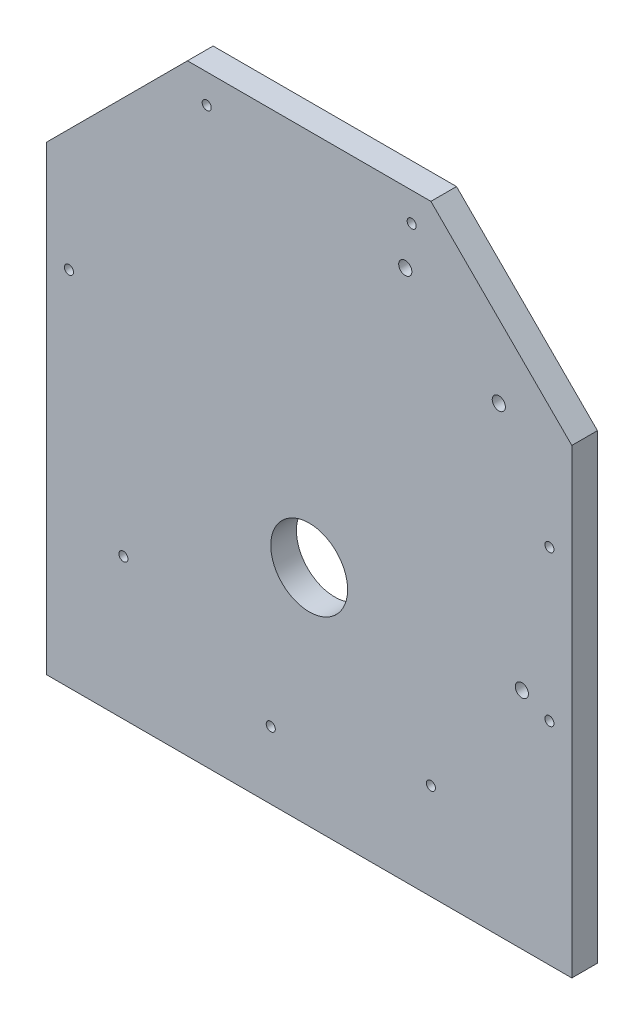
ISO-10303-21;
HEADER;
FILE_DESCRIPTION(('STEP AP214'),'2;1');
FILE_NAME('part.step','',(''),(''),'','','');
FILE_SCHEMA(('AUTOMOTIVE_DESIGN { 1 0 10303 214 1 1 1 1 }'));
ENDSEC;
DATA;
#1=APPLICATION_CONTEXT('core data for automotive mechanical design processes');
#2=APPLICATION_PROTOCOL_DEFINITION('international standard','automotive_design',2000,#1);
#3=PRODUCT_CONTEXT('',#1,'mechanical');
#4=PRODUCT('Part','Part','',(#3));
#5=PRODUCT_RELATED_PRODUCT_CATEGORY('part','',(#4));
#6=PRODUCT_DEFINITION_FORMATION('','',#4);
#7=PRODUCT_DEFINITION_CONTEXT('part definition',#1,'design');
#8=PRODUCT_DEFINITION('design','',#6,#7);
#9=PRODUCT_DEFINITION_SHAPE('','',#8);
#10=(LENGTH_UNIT() NAMED_UNIT(*) SI_UNIT(.MILLI.,.METRE.));
#11=(NAMED_UNIT(*) PLANE_ANGLE_UNIT() SI_UNIT($,.RADIAN.));
#12=(NAMED_UNIT(*) SI_UNIT($,.STERADIAN.) SOLID_ANGLE_UNIT());
#13=UNCERTAINTY_MEASURE_WITH_UNIT(LENGTH_MEASURE(1.E-05),#10,'distance_accuracy_value','');
#14=(GEOMETRIC_REPRESENTATION_CONTEXT(3) GLOBAL_UNCERTAINTY_ASSIGNED_CONTEXT((#13)) GLOBAL_UNIT_ASSIGNED_CONTEXT((#10,
#11,#12)) REPRESENTATION_CONTEXT('',''));
#15=CARTESIAN_POINT('',(0.,0.,0.));
#16=DIRECTION('',(0.,0.,1.));
#17=DIRECTION('',(1.,0.,0.));
#18=AXIS2_PLACEMENT_3D('',#15,#16,#17);
#19=CARTESIAN_POINT('',(0.,0.,12.7));
#20=DIRECTION('',(0.,0.,1.));
#21=DIRECTION('',(1.,0.,0.));
#22=AXIS2_PLACEMENT_3D('',#19,#20,#21);
#23=PLANE('',#22);
#24=CARTESIAN_POINT('',(105.41,-57.15,12.7));
#25=DIRECTION('',(0.,0.,-1.));
#26=DIRECTION('',(-1.,0.,0.));
#27=AXIS2_PLACEMENT_3D('',#24,#25,#26);
#28=CIRCLE('',#27,3.2639);
#29=CARTESIAN_POINT('',(102.1461,-57.15,12.7));
#30=VERTEX_POINT('',#29);
#31=EDGE_CURVE('E233',#30,#30,#28,.T.);
#32=ORIENTED_EDGE('',*,*,#31,.T.);
#33=EDGE_LOOP('',(#32));
#34=FACE_BOUND('',#33,.T.);
#35=CARTESIAN_POINT('',(93.98,60.325,12.7));
#36=DIRECTION('',(0.,0.,-1.));
#37=DIRECTION('',(-1.,0.,0.));
#38=AXIS2_PLACEMENT_3D('',#35,#36,#37);
#39=CIRCLE('',#38,3.2639);
#40=CARTESIAN_POINT('',(90.7161,60.325,12.7));
#41=VERTEX_POINT('',#40);
#42=EDGE_CURVE('E246',#41,#41,#39,.T.);
#43=ORIENTED_EDGE('',*,*,#42,.T.);
#44=EDGE_LOOP('',(#43));
#45=FACE_BOUND('',#44,.T.);
#46=CARTESIAN_POINT('',(47.625,95.25,12.7));
#47=DIRECTION('',(0.,0.,-1.));
#48=DIRECTION('',(-1.,0.,0.));
#49=AXIS2_PLACEMENT_3D('',#46,#47,#48);
#50=CIRCLE('',#49,3.2639);
#51=CARTESIAN_POINT('',(44.3611,95.25,12.7));
#52=VERTEX_POINT('',#51);
#53=EDGE_CURVE('E254',#52,#52,#50,.T.);
#54=ORIENTED_EDGE('',*,*,#53,.T.);
#55=EDGE_LOOP('',(#54));
#56=FACE_BOUND('',#55,.T.);
#57=CARTESIAN_POINT('',(-50.8,115.9002,12.7));
#58=DIRECTION('',(0.,0.,1.));
#59=DIRECTION('',(1.,0.,0.));
#60=AXIS2_PLACEMENT_3D('',#57,#58,#59);
#61=CIRCLE('',#60,2.2479);
#62=CARTESIAN_POINT('',(-48.5521,115.9002,12.7));
#63=VERTEX_POINT('',#62);
#64=EDGE_CURVE('E258',#63,#63,#61,.T.);
#65=ORIENTED_EDGE('',*,*,#64,.F.);
#66=EDGE_LOOP('',(#65));
#67=FACE_BOUND('',#66,.T.);
#68=CARTESIAN_POINT('',(50.8,115.9002,12.7));
#69=DIRECTION('',(0.,0.,1.));
#70=DIRECTION('',(1.,0.,0.));
#71=AXIS2_PLACEMENT_3D('',#68,#69,#70);
#72=CIRCLE('',#71,2.2479);
#73=CARTESIAN_POINT('',(53.0479,115.9002,12.7));
#74=VERTEX_POINT('',#73);
#75=EDGE_CURVE('E266',#74,#74,#72,.T.);
#76=ORIENTED_EDGE('',*,*,#75,.F.);
#77=EDGE_LOOP('',(#76));
#78=FACE_BOUND('',#77,.T.);
#79=CARTESIAN_POINT('',(119.0752,11.1252,12.7));
#80=DIRECTION('',(0.,0.,1.));
#81=DIRECTION('',(1.,0.,0.));
#82=AXIS2_PLACEMENT_3D('',#79,#80,#81);
#83=CIRCLE('',#82,2.2479);
#84=CARTESIAN_POINT('',(121.3231,11.1252,12.7));
#85=VERTEX_POINT('',#84);
#86=EDGE_CURVE('E274',#85,#85,#83,.T.);
#87=ORIENTED_EDGE('',*,*,#86,.F.);
#88=EDGE_LOOP('',(#87));
#89=FACE_BOUND('',#88,.T.);
#90=CARTESIAN_POINT('',(119.0752,-63.5,12.7));
#91=DIRECTION('',(0.,0.,1.));
#92=DIRECTION('',(1.,0.,0.));
#93=AXIS2_PLACEMENT_3D('',#90,#91,#92);
#94=CIRCLE('',#93,2.2479);
#95=CARTESIAN_POINT('',(121.3231,-63.5,12.7));
#96=VERTEX_POINT('',#95);
#97=EDGE_CURVE('E282',#96,#96,#94,.T.);
#98=ORIENTED_EDGE('',*,*,#97,.F.);
#99=EDGE_LOOP('',(#98));
#100=FACE_BOUND('',#99,.T.);
#101=CARTESIAN_POINT('',(60.325,-120.65,12.7));
#102=DIRECTION('',(0.,0.,1.));
#103=DIRECTION('',(1.,0.,0.));
#104=AXIS2_PLACEMENT_3D('',#101,#102,#103);
#105=CIRCLE('',#104,2.2479);
#106=CARTESIAN_POINT('',(62.5729,-120.65,12.7));
#107=VERTEX_POINT('',#106);
#108=EDGE_CURVE('E290',#107,#107,#105,.T.);
#109=ORIENTED_EDGE('',*,*,#108,.F.);
#110=EDGE_LOOP('',(#109));
#111=FACE_BOUND('',#110,.T.);
#112=CARTESIAN_POINT('',(-19.05,-134.9375,12.7));
#113=DIRECTION('',(0.,0.,1.));
#114=DIRECTION('',(1.,0.,0.));
#115=AXIS2_PLACEMENT_3D('',#112,#113,#114);
#116=CIRCLE('',#115,2.2479);
#117=CARTESIAN_POINT('',(-16.8021,-134.9375,12.7));
#118=VERTEX_POINT('',#117);
#119=EDGE_CURVE('E298',#118,#118,#116,.T.);
#120=ORIENTED_EDGE('',*,*,#119,.F.);
#121=EDGE_LOOP('',(#120));
#122=FACE_BOUND('',#121,.T.);
#123=CARTESIAN_POINT('',(-92.075,-98.425,12.7));
#124=DIRECTION('',(0.,0.,1.));
#125=DIRECTION('',(1.,0.,0.));
#126=AXIS2_PLACEMENT_3D('',#123,#124,#125);
#127=CIRCLE('',#126,2.2479);
#128=CARTESIAN_POINT('',(-89.8271,-98.425,12.7));
#129=VERTEX_POINT('',#128);
#130=EDGE_CURVE('E306',#129,#129,#127,.T.);
#131=ORIENTED_EDGE('',*,*,#130,.F.);
#132=EDGE_LOOP('',(#131));
#133=FACE_BOUND('',#132,.T.);
#134=CARTESIAN_POINT('',(-119.0752,11.1252,12.7));
#135=DIRECTION('',(0.,0.,1.));
#136=DIRECTION('',(1.,0.,0.));
#137=AXIS2_PLACEMENT_3D('',#134,#135,#136);
#138=CIRCLE('',#137,2.2479);
#139=CARTESIAN_POINT('',(-116.8273,11.1252,12.7));
#140=VERTEX_POINT('',#139);
#141=EDGE_CURVE('E314',#140,#140,#138,.T.);
#142=ORIENTED_EDGE('',*,*,#141,.F.);
#143=EDGE_LOOP('',(#142));
#144=FACE_BOUND('',#143,.T.);
#145=DIRECTION('',(0.,1.,0.));
#146=VECTOR('',#145,1.);
#147=CARTESIAN_POINT('',(130.175,-168.275,12.7));
#148=LINE('',#147,#146);
#149=CARTESIAN_POINT('',(130.175,-168.275,12.7));
#150=VERTEX_POINT('',#149);
#151=CARTESIAN_POINT('',(130.175,60.3249999999998,12.7));
#152=VERTEX_POINT('',#151);
#153=EDGE_CURVE('E145',#150,#152,#148,.T.);
#154=ORIENTED_EDGE('',*,*,#153,.T.);
#155=DIRECTION('',(-0.707106781186546,0.707106781186549,0.));
#156=VECTOR('',#155,1.);
#157=CARTESIAN_POINT('',(130.175,60.3249999999998,12.7));
#158=LINE('',#157,#156);
#159=CARTESIAN_POINT('',(60.325,130.175,12.7));
#160=VERTEX_POINT('',#159);
#161=EDGE_CURVE('E93',#152,#160,#158,.T.);
#162=ORIENTED_EDGE('',*,*,#161,.T.);
#163=DIRECTION('',(-1.,0.,0.));
#164=VECTOR('',#163,1.);
#165=CARTESIAN_POINT('',(60.325,130.175,12.7));
#166=LINE('',#165,#164);
#167=CARTESIAN_POINT('',(-60.325,130.175,12.7));
#168=VERTEX_POINT('',#167);
#169=EDGE_CURVE('E106',#160,#168,#166,.T.);
#170=ORIENTED_EDGE('',*,*,#169,.T.);
#171=DIRECTION('',(-0.707106781186549,-0.707106781186547,0.));
#172=VECTOR('',#171,1.);
#173=CARTESIAN_POINT('',(-60.325,130.175,12.7));
#174=LINE('',#173,#172);
#175=CARTESIAN_POINT('',(-130.175,60.3250000000002,12.7));
#176=VERTEX_POINT('',#175);
#177=EDGE_CURVE('E100',#168,#176,#174,.T.);
#178=ORIENTED_EDGE('',*,*,#177,.T.);
#179=DIRECTION('',(0.,-1.,0.));
#180=VECTOR('',#179,1.);
#181=CARTESIAN_POINT('',(-130.175,60.3250000000002,12.7));
#182=LINE('',#181,#180);
#183=CARTESIAN_POINT('',(-130.175,-168.275,12.7));
#184=VERTEX_POINT('',#183);
#185=EDGE_CURVE('E104',#176,#184,#182,.T.);
#186=ORIENTED_EDGE('',*,*,#185,.T.);
#187=DIRECTION('',(1.,0.,0.));
#188=VECTOR('',#187,1.);
#189=CARTESIAN_POINT('',(-130.175,-168.275,12.7));
#190=LINE('',#189,#188);
#191=EDGE_CURVE('E56',#184,#150,#190,.T.);
#192=ORIENTED_EDGE('',*,*,#191,.T.);
#193=EDGE_LOOP('',(#154,#162,#170,#178,#186,#192));
#194=FACE_BOUND('',#193,.T.);
#195=CARTESIAN_POINT('',(0.,-57.15,12.7));
#196=DIRECTION('',(0.,0.,1.));
#197=DIRECTION('',(1.,0.,0.));
#198=AXIS2_PLACEMENT_3D('',#195,#196,#197);
#199=CIRCLE('',#198,19.05);
#200=CARTESIAN_POINT('',(19.05,-57.15,12.7));
#201=VERTEX_POINT('',#200);
#202=EDGE_CURVE('E133',#201,#201,#199,.T.);
#203=ORIENTED_EDGE('',*,*,#202,.F.);
#204=EDGE_LOOP('',(#203));
#205=FACE_BOUND('',#204,.T.);
#206=ADVANCED_FACE('F38',(#34,#45,#56,#67,#78,#89,#100,#111,#122,#133,#144,#194,#205),#23,.T.);
#207=CARTESIAN_POINT('',(0.,0.,0.));
#208=DIRECTION('',(0.,0.,1.));
#209=DIRECTION('',(1.,0.,0.));
#210=AXIS2_PLACEMENT_3D('',#207,#208,#209);
#211=PLANE('',#210);
#212=CARTESIAN_POINT('',(105.41,-57.15,0.));
#213=DIRECTION('',(0.,0.,-1.));
#214=DIRECTION('',(-1.,0.,0.));
#215=AXIS2_PLACEMENT_3D('',#212,#213,#214);
#216=CIRCLE('',#215,3.2639);
#217=CARTESIAN_POINT('',(102.1461,-57.15,0.));
#218=VERTEX_POINT('',#217);
#219=EDGE_CURVE('E236',#218,#218,#216,.T.);
#220=ORIENTED_EDGE('',*,*,#219,.F.);
#221=EDGE_LOOP('',(#220));
#222=FACE_BOUND('',#221,.T.);
#223=CARTESIAN_POINT('',(93.98,60.325,0.));
#224=DIRECTION('',(0.,0.,-1.));
#225=DIRECTION('',(-1.,0.,0.));
#226=AXIS2_PLACEMENT_3D('',#223,#224,#225);
#227=CIRCLE('',#226,3.2639);
#228=CARTESIAN_POINT('',(90.7161,60.325,0.));
#229=VERTEX_POINT('',#228);
#230=EDGE_CURVE('E240',#229,#229,#227,.T.);
#231=ORIENTED_EDGE('',*,*,#230,.F.);
#232=EDGE_LOOP('',(#231));
#233=FACE_BOUND('',#232,.T.);
#234=CARTESIAN_POINT('',(47.625,95.25,0.));
#235=DIRECTION('',(0.,0.,-1.));
#236=DIRECTION('',(-1.,0.,0.));
#237=AXIS2_PLACEMENT_3D('',#234,#235,#236);
#238=CIRCLE('',#237,3.2639);
#239=CARTESIAN_POINT('',(44.3611,95.25,0.));
#240=VERTEX_POINT('',#239);
#241=EDGE_CURVE('E250',#240,#240,#238,.T.);
#242=ORIENTED_EDGE('',*,*,#241,.F.);
#243=EDGE_LOOP('',(#242));
#244=FACE_BOUND('',#243,.T.);
#245=CARTESIAN_POINT('',(-50.8,115.9002,0.));
#246=DIRECTION('',(0.,0.,1.));
#247=DIRECTION('',(1.,0.,0.));
#248=AXIS2_PLACEMENT_3D('',#245,#246,#247);
#249=CIRCLE('',#248,2.2479);
#250=CARTESIAN_POINT('',(-48.5521,115.9002,0.));
#251=VERTEX_POINT('',#250);
#252=EDGE_CURVE('E262',#251,#251,#249,.T.);
#253=ORIENTED_EDGE('',*,*,#252,.T.);
#254=EDGE_LOOP('',(#253));
#255=FACE_BOUND('',#254,.T.);
#256=CARTESIAN_POINT('',(50.8,115.9002,0.));
#257=DIRECTION('',(0.,0.,1.));
#258=DIRECTION('',(1.,0.,0.));
#259=AXIS2_PLACEMENT_3D('',#256,#257,#258);
#260=CIRCLE('',#259,2.2479);
#261=CARTESIAN_POINT('',(53.0479,115.9002,0.));
#262=VERTEX_POINT('',#261);
#263=EDGE_CURVE('E270',#262,#262,#260,.T.);
#264=ORIENTED_EDGE('',*,*,#263,.T.);
#265=EDGE_LOOP('',(#264));
#266=FACE_BOUND('',#265,.T.);
#267=CARTESIAN_POINT('',(119.0752,11.1252,0.));
#268=DIRECTION('',(0.,0.,1.));
#269=DIRECTION('',(1.,0.,0.));
#270=AXIS2_PLACEMENT_3D('',#267,#268,#269);
#271=CIRCLE('',#270,2.2479);
#272=CARTESIAN_POINT('',(121.3231,11.1252,0.));
#273=VERTEX_POINT('',#272);
#274=EDGE_CURVE('E278',#273,#273,#271,.T.);
#275=ORIENTED_EDGE('',*,*,#274,.T.);
#276=EDGE_LOOP('',(#275));
#277=FACE_BOUND('',#276,.T.);
#278=CARTESIAN_POINT('',(119.0752,-63.5,0.));
#279=DIRECTION('',(0.,0.,1.));
#280=DIRECTION('',(1.,0.,0.));
#281=AXIS2_PLACEMENT_3D('',#278,#279,#280);
#282=CIRCLE('',#281,2.2479);
#283=CARTESIAN_POINT('',(121.3231,-63.5,0.));
#284=VERTEX_POINT('',#283);
#285=EDGE_CURVE('E286',#284,#284,#282,.T.);
#286=ORIENTED_EDGE('',*,*,#285,.T.);
#287=EDGE_LOOP('',(#286));
#288=FACE_BOUND('',#287,.T.);
#289=CARTESIAN_POINT('',(60.325,-120.65,0.));
#290=DIRECTION('',(0.,0.,1.));
#291=DIRECTION('',(1.,0.,0.));
#292=AXIS2_PLACEMENT_3D('',#289,#290,#291);
#293=CIRCLE('',#292,2.2479);
#294=CARTESIAN_POINT('',(62.5729,-120.65,0.));
#295=VERTEX_POINT('',#294);
#296=EDGE_CURVE('E294',#295,#295,#293,.T.);
#297=ORIENTED_EDGE('',*,*,#296,.T.);
#298=EDGE_LOOP('',(#297));
#299=FACE_BOUND('',#298,.T.);
#300=CARTESIAN_POINT('',(-19.05,-134.9375,0.));
#301=DIRECTION('',(0.,0.,1.));
#302=DIRECTION('',(1.,0.,0.));
#303=AXIS2_PLACEMENT_3D('',#300,#301,#302);
#304=CIRCLE('',#303,2.2479);
#305=CARTESIAN_POINT('',(-16.8021,-134.9375,0.));
#306=VERTEX_POINT('',#305);
#307=EDGE_CURVE('E302',#306,#306,#304,.T.);
#308=ORIENTED_EDGE('',*,*,#307,.T.);
#309=EDGE_LOOP('',(#308));
#310=FACE_BOUND('',#309,.T.);
#311=CARTESIAN_POINT('',(-92.075,-98.425,0.));
#312=DIRECTION('',(0.,0.,1.));
#313=DIRECTION('',(1.,0.,0.));
#314=AXIS2_PLACEMENT_3D('',#311,#312,#313);
#315=CIRCLE('',#314,2.2479);
#316=CARTESIAN_POINT('',(-89.8271,-98.425,0.));
#317=VERTEX_POINT('',#316);
#318=EDGE_CURVE('E310',#317,#317,#315,.T.);
#319=ORIENTED_EDGE('',*,*,#318,.T.);
#320=EDGE_LOOP('',(#319));
#321=FACE_BOUND('',#320,.T.);
#322=CARTESIAN_POINT('',(-119.0752,11.1252,0.));
#323=DIRECTION('',(0.,0.,1.));
#324=DIRECTION('',(1.,0.,0.));
#325=AXIS2_PLACEMENT_3D('',#322,#323,#324);
#326=CIRCLE('',#325,2.2479);
#327=CARTESIAN_POINT('',(-116.8273,11.1252,0.));
#328=VERTEX_POINT('',#327);
#329=EDGE_CURVE('E318',#328,#328,#326,.T.);
#330=ORIENTED_EDGE('',*,*,#329,.T.);
#331=EDGE_LOOP('',(#330));
#332=FACE_BOUND('',#331,.T.);
#333=DIRECTION('',(0.,1.,0.));
#334=VECTOR('',#333,1.);
#335=CARTESIAN_POINT('',(130.175,-168.275,0.));
#336=LINE('',#335,#334);
#337=CARTESIAN_POINT('',(130.175,-168.275,0.));
#338=VERTEX_POINT('',#337);
#339=CARTESIAN_POINT('',(130.175,60.3249999999998,0.));
#340=VERTEX_POINT('',#339);
#341=EDGE_CURVE('E128',#338,#340,#336,.T.);
#342=ORIENTED_EDGE('',*,*,#341,.F.);
#343=DIRECTION('',(1.,0.,0.));
#344=VECTOR('',#343,1.);
#345=CARTESIAN_POINT('',(-130.175,-168.275,0.));
#346=LINE('',#345,#344);
#347=CARTESIAN_POINT('',(-130.175,-168.275,0.));
#348=VERTEX_POINT('',#347);
#349=EDGE_CURVE('E85',#348,#338,#346,.T.);
#350=ORIENTED_EDGE('',*,*,#349,.F.);
#351=DIRECTION('',(0.,-1.,0.));
#352=VECTOR('',#351,1.);
#353=CARTESIAN_POINT('',(-130.175,60.3250000000002,0.));
#354=LINE('',#353,#352);
#355=CARTESIAN_POINT('',(-130.175,60.3250000000002,0.));
#356=VERTEX_POINT('',#355);
#357=EDGE_CURVE('E79',#356,#348,#354,.T.);
#358=ORIENTED_EDGE('',*,*,#357,.F.);
#359=DIRECTION('',(-0.707106781186549,-0.707106781186547,0.));
#360=VECTOR('',#359,1.);
#361=CARTESIAN_POINT('',(-60.325,130.175,0.));
#362=LINE('',#361,#360);
#363=CARTESIAN_POINT('',(-60.325,130.175,0.));
#364=VERTEX_POINT('',#363);
#365=EDGE_CURVE('E115',#364,#356,#362,.T.);
#366=ORIENTED_EDGE('',*,*,#365,.F.);
#367=DIRECTION('',(-1.,0.,0.));
#368=VECTOR('',#367,1.);
#369=CARTESIAN_POINT('',(60.325,130.175,0.));
#370=LINE('',#369,#368);
#371=CARTESIAN_POINT('',(60.325,130.175,0.));
#372=VERTEX_POINT('',#371);
#373=EDGE_CURVE('E136',#372,#364,#370,.T.);
#374=ORIENTED_EDGE('',*,*,#373,.F.);
#375=DIRECTION('',(-0.707106781186546,0.707106781186549,0.));
#376=VECTOR('',#375,1.);
#377=CARTESIAN_POINT('',(130.175,60.3249999999998,0.));
#378=LINE('',#377,#376);
#379=EDGE_CURVE('E132',#340,#372,#378,.T.);
#380=ORIENTED_EDGE('',*,*,#379,.F.);
#381=EDGE_LOOP('',(#342,#350,#358,#366,#374,#380));
#382=FACE_BOUND('',#381,.T.);
#383=CARTESIAN_POINT('',(0.,-57.15,0.));
#384=DIRECTION('',(0.,0.,1.));
#385=DIRECTION('',(1.,0.,0.));
#386=AXIS2_PLACEMENT_3D('',#383,#384,#385);
#387=CIRCLE('',#386,19.05);
#388=CARTESIAN_POINT('',(19.05,-57.15,0.));
#389=VERTEX_POINT('',#388);
#390=EDGE_CURVE('E322',#389,#389,#387,.T.);
#391=ORIENTED_EDGE('',*,*,#390,.T.);
#392=EDGE_LOOP('',(#391));
#393=FACE_BOUND('',#392,.T.);
#394=ADVANCED_FACE('F158',(#222,#233,#244,#255,#266,#277,#288,#299,#310,#321,#332,#382,#393),
#211,.F.);
#395=CARTESIAN_POINT('',(130.175,-168.275,12.7));
#396=DIRECTION('',(-1.,0.,0.));
#397=DIRECTION('',(0.,-1.,0.));
#398=AXIS2_PLACEMENT_3D('',#395,#396,#397);
#399=PLANE('',#398);
#400=ORIENTED_EDGE('',*,*,#341,.T.);
#401=DIRECTION('',(0.,0.,-1.));
#402=VECTOR('',#401,1.);
#403=CARTESIAN_POINT('',(130.175,60.3249999999998,12.7));
#404=LINE('',#403,#402);
#405=EDGE_CURVE('E11',#152,#340,#404,.T.);
#406=ORIENTED_EDGE('',*,*,#405,.F.);
#407=ORIENTED_EDGE('',*,*,#153,.F.);
#408=DIRECTION('',(0.,0.,-1.));
#409=VECTOR('',#408,1.);
#410=CARTESIAN_POINT('',(130.175,-168.275,12.7));
#411=LINE('',#410,#409);
#412=EDGE_CURVE('E124',#150,#338,#411,.T.);
#413=ORIENTED_EDGE('',*,*,#412,.T.);
#414=EDGE_LOOP('',(#400,#406,#407,#413));
#415=FACE_BOUND('',#414,.T.);
#416=ADVANCED_FACE('F40',(#415),#399,.F.);
#417=CARTESIAN_POINT('',(130.175,60.3249999999998,12.7));
#418=DIRECTION('',(-0.707106781186549,-0.707106781186546,0.));
#419=DIRECTION('',(0.707106781186546,-0.707106781186549,0.));
#420=AXIS2_PLACEMENT_3D('',#417,#418,#419);
#421=PLANE('',#420);
#422=ORIENTED_EDGE('',*,*,#379,.T.);
#423=DIRECTION('',(0.,0.,-1.));
#424=VECTOR('',#423,1.);
#425=CARTESIAN_POINT('',(60.325,130.175,12.7));
#426=LINE('',#425,#424);
#427=EDGE_CURVE('E48',#160,#372,#426,.T.);
#428=ORIENTED_EDGE('',*,*,#427,.F.);
#429=ORIENTED_EDGE('',*,*,#161,.F.);
#430=ORIENTED_EDGE('',*,*,#405,.T.);
#431=EDGE_LOOP('',(#422,#428,#429,#430));
#432=FACE_BOUND('',#431,.T.);
#433=ADVANCED_FACE('F457',(#432),#421,.F.);
#434=CARTESIAN_POINT('',(60.325,130.175,12.7));
#435=DIRECTION('',(0.,-1.,0.));
#436=DIRECTION('',(0.,0.,-1.));
#437=AXIS2_PLACEMENT_3D('',#434,#435,#436);
#438=PLANE('',#437);
#439=ORIENTED_EDGE('',*,*,#373,.T.);
#440=DIRECTION('',(0.,0.,-1.));
#441=VECTOR('',#440,1.);
#442=CARTESIAN_POINT('',(-60.325,130.175,12.7));
#443=LINE('',#442,#441);
#444=EDGE_CURVE('E117',#168,#364,#443,.T.);
#445=ORIENTED_EDGE('',*,*,#444,.F.);
#446=ORIENTED_EDGE('',*,*,#169,.F.);
#447=ORIENTED_EDGE('',*,*,#427,.T.);
#448=EDGE_LOOP('',(#439,#445,#446,#447));
#449=FACE_BOUND('',#448,.T.);
#450=ADVANCED_FACE('F155',(#449),#438,.F.);
#451=CARTESIAN_POINT('',(-60.325,130.175,12.7));
#452=DIRECTION('',(0.707106781186547,-0.707106781186548,0.));
#453=DIRECTION('',(0.707106781186548,0.707106781186547,0.));
#454=AXIS2_PLACEMENT_3D('',#451,#452,#453);
#455=PLANE('',#454);
#456=ORIENTED_EDGE('',*,*,#365,.T.);
#457=DIRECTION('',(0.,0.,-1.));
#458=VECTOR('',#457,1.);
#459=CARTESIAN_POINT('',(-130.175,60.3250000000002,12.7));
#460=LINE('',#459,#458);
#461=EDGE_CURVE('E112',#176,#356,#460,.T.);
#462=ORIENTED_EDGE('',*,*,#461,.F.);
#463=ORIENTED_EDGE('',*,*,#177,.F.);
#464=ORIENTED_EDGE('',*,*,#444,.T.);
#465=EDGE_LOOP('',(#456,#462,#463,#464));
#466=FACE_BOUND('',#465,.T.);
#467=ADVANCED_FACE('F113',(#466),#455,.F.);
#468=CARTESIAN_POINT('',(-130.175,60.3250000000002,12.7));
#469=DIRECTION('',(1.,0.,0.));
#470=DIRECTION('',(0.,1.,0.));
#471=AXIS2_PLACEMENT_3D('',#468,#469,#470);
#472=PLANE('',#471);
#473=ORIENTED_EDGE('',*,*,#357,.T.);
#474=DIRECTION('',(0.,0.,-1.));
#475=VECTOR('',#474,1.);
#476=CARTESIAN_POINT('',(-130.175,-168.275,12.7));
#477=LINE('',#476,#475);
#478=EDGE_CURVE('E118',#184,#348,#477,.T.);
#479=ORIENTED_EDGE('',*,*,#478,.F.);
#480=ORIENTED_EDGE('',*,*,#185,.F.);
#481=ORIENTED_EDGE('',*,*,#461,.T.);
#482=EDGE_LOOP('',(#473,#479,#480,#481));
#483=FACE_BOUND('',#482,.T.);
#484=ADVANCED_FACE('F120',(#483),#472,.F.);
#485=CARTESIAN_POINT('',(-130.175,-168.275,12.7));
#486=DIRECTION('',(0.,1.,0.));
#487=DIRECTION('',(0.,0.,1.));
#488=AXIS2_PLACEMENT_3D('',#485,#486,#487);
#489=PLANE('',#488);
#490=ORIENTED_EDGE('',*,*,#349,.T.);
#491=ORIENTED_EDGE('',*,*,#412,.F.);
#492=ORIENTED_EDGE('',*,*,#191,.F.);
#493=ORIENTED_EDGE('',*,*,#478,.T.);
#494=EDGE_LOOP('',(#490,#491,#492,#493));
#495=FACE_BOUND('',#494,.T.);
#496=ADVANCED_FACE('F163',(#495),#489,.F.);
#497=CARTESIAN_POINT('',(0.,-57.15,12.7));
#498=DIRECTION('',(0.,0.,-1.));
#499=DIRECTION('',(-1.,0.,0.));
#500=AXIS2_PLACEMENT_3D('',#497,#498,#499);
#501=CYLINDRICAL_SURFACE('',#500,19.05);
#502=ORIENTED_EDGE('',*,*,#202,.T.);
#503=EDGE_LOOP('',(#502));
#504=FACE_BOUND('',#503,.T.);
#505=ORIENTED_EDGE('',*,*,#390,.F.);
#506=EDGE_LOOP('',(#505));
#507=FACE_BOUND('',#506,.T.);
#508=ADVANCED_FACE('F165',(#504,#507),#501,.F.);
#509=CARTESIAN_POINT('',(-119.0752,11.1252,12.7));
#510=DIRECTION('',(0.,0.,1.));
#511=DIRECTION('',(1.,0.,0.));
#512=AXIS2_PLACEMENT_3D('',#509,#510,#511);
#513=CYLINDRICAL_SURFACE('',#512,2.2479);
#514=ORIENTED_EDGE('',*,*,#329,.F.);
#515=EDGE_LOOP('',(#514));
#516=FACE_BOUND('',#515,.T.);
#517=ORIENTED_EDGE('',*,*,#141,.T.);
#518=EDGE_LOOP('',(#517));
#519=FACE_BOUND('',#518,.T.);
#520=ADVANCED_FACE('F171',(#516,#519),#513,.F.);
#521=CARTESIAN_POINT('',(-92.075,-98.425,12.7));
#522=DIRECTION('',(0.,0.,1.));
#523=DIRECTION('',(1.,0.,0.));
#524=AXIS2_PLACEMENT_3D('',#521,#522,#523);
#525=CYLINDRICAL_SURFACE('',#524,2.2479);
#526=ORIENTED_EDGE('',*,*,#318,.F.);
#527=EDGE_LOOP('',(#526));
#528=FACE_BOUND('',#527,.T.);
#529=ORIENTED_EDGE('',*,*,#130,.T.);
#530=EDGE_LOOP('',(#529));
#531=FACE_BOUND('',#530,.T.);
#532=ADVANCED_FACE('F189',(#528,#531),#525,.F.);
#533=CARTESIAN_POINT('',(-19.05,-134.9375,12.7));
#534=DIRECTION('',(0.,0.,1.));
#535=DIRECTION('',(1.,0.,0.));
#536=AXIS2_PLACEMENT_3D('',#533,#534,#535);
#537=CYLINDRICAL_SURFACE('',#536,2.2479);
#538=ORIENTED_EDGE('',*,*,#307,.F.);
#539=EDGE_LOOP('',(#538));
#540=FACE_BOUND('',#539,.T.);
#541=ORIENTED_EDGE('',*,*,#119,.T.);
#542=EDGE_LOOP('',(#541));
#543=FACE_BOUND('',#542,.T.);
#544=ADVANCED_FACE('F193',(#540,#543),#537,.F.);
#545=CARTESIAN_POINT('',(60.325,-120.65,12.7));
#546=DIRECTION('',(0.,0.,1.));
#547=DIRECTION('',(1.,0.,0.));
#548=AXIS2_PLACEMENT_3D('',#545,#546,#547);
#549=CYLINDRICAL_SURFACE('',#548,2.2479);
#550=ORIENTED_EDGE('',*,*,#296,.F.);
#551=EDGE_LOOP('',(#550));
#552=FACE_BOUND('',#551,.T.);
#553=ORIENTED_EDGE('',*,*,#108,.T.);
#554=EDGE_LOOP('',(#553));
#555=FACE_BOUND('',#554,.T.);
#556=ADVANCED_FACE('F197',(#552,#555),#549,.F.);
#557=CARTESIAN_POINT('',(119.0752,-63.5,12.7));
#558=DIRECTION('',(0.,0.,1.));
#559=DIRECTION('',(1.,0.,0.));
#560=AXIS2_PLACEMENT_3D('',#557,#558,#559);
#561=CYLINDRICAL_SURFACE('',#560,2.2479);
#562=ORIENTED_EDGE('',*,*,#285,.F.);
#563=EDGE_LOOP('',(#562));
#564=FACE_BOUND('',#563,.T.);
#565=ORIENTED_EDGE('',*,*,#97,.T.);
#566=EDGE_LOOP('',(#565));
#567=FACE_BOUND('',#566,.T.);
#568=ADVANCED_FACE('F201',(#564,#567),#561,.F.);
#569=CARTESIAN_POINT('',(119.0752,11.1252,12.7));
#570=DIRECTION('',(0.,0.,1.));
#571=DIRECTION('',(1.,0.,0.));
#572=AXIS2_PLACEMENT_3D('',#569,#570,#571);
#573=CYLINDRICAL_SURFACE('',#572,2.2479);
#574=ORIENTED_EDGE('',*,*,#274,.F.);
#575=EDGE_LOOP('',(#574));
#576=FACE_BOUND('',#575,.T.);
#577=ORIENTED_EDGE('',*,*,#86,.T.);
#578=EDGE_LOOP('',(#577));
#579=FACE_BOUND('',#578,.T.);
#580=ADVANCED_FACE('F205',(#576,#579),#573,.F.);
#581=CARTESIAN_POINT('',(50.8,115.9002,12.7));
#582=DIRECTION('',(0.,0.,1.));
#583=DIRECTION('',(1.,0.,0.));
#584=AXIS2_PLACEMENT_3D('',#581,#582,#583);
#585=CYLINDRICAL_SURFACE('',#584,2.2479);
#586=ORIENTED_EDGE('',*,*,#263,.F.);
#587=EDGE_LOOP('',(#586));
#588=FACE_BOUND('',#587,.T.);
#589=ORIENTED_EDGE('',*,*,#75,.T.);
#590=EDGE_LOOP('',(#589));
#591=FACE_BOUND('',#590,.T.);
#592=ADVANCED_FACE('F209',(#588,#591),#585,.F.);
#593=CARTESIAN_POINT('',(-50.8,115.9002,12.7));
#594=DIRECTION('',(0.,0.,1.));
#595=DIRECTION('',(1.,0.,0.));
#596=AXIS2_PLACEMENT_3D('',#593,#594,#595);
#597=CYLINDRICAL_SURFACE('',#596,2.2479);
#598=ORIENTED_EDGE('',*,*,#252,.F.);
#599=EDGE_LOOP('',(#598));
#600=FACE_BOUND('',#599,.T.);
#601=ORIENTED_EDGE('',*,*,#64,.T.);
#602=EDGE_LOOP('',(#601));
#603=FACE_BOUND('',#602,.T.);
#604=ADVANCED_FACE('F213',(#600,#603),#597,.F.);
#605=CARTESIAN_POINT('',(47.625,95.25,0.));
#606=DIRECTION('',(0.,0.,-1.));
#607=DIRECTION('',(-1.,0.,0.));
#608=AXIS2_PLACEMENT_3D('',#605,#606,#607);
#609=CYLINDRICAL_SURFACE('',#608,3.2639);
#610=ORIENTED_EDGE('',*,*,#53,.F.);
#611=EDGE_LOOP('',(#610));
#612=FACE_BOUND('',#611,.T.);
#613=ORIENTED_EDGE('',*,*,#241,.T.);
#614=EDGE_LOOP('',(#613));
#615=FACE_BOUND('',#614,.T.);
#616=ADVANCED_FACE('F217',(#612,#615),#609,.F.);
#617=CARTESIAN_POINT('',(93.98,60.325,0.));
#618=DIRECTION('',(0.,0.,-1.));
#619=DIRECTION('',(-1.,0.,0.));
#620=AXIS2_PLACEMENT_3D('',#617,#618,#619);
#621=CYLINDRICAL_SURFACE('',#620,3.2639);
#622=ORIENTED_EDGE('',*,*,#42,.F.);
#623=EDGE_LOOP('',(#622));
#624=FACE_BOUND('',#623,.T.);
#625=ORIENTED_EDGE('',*,*,#230,.T.);
#626=EDGE_LOOP('',(#625));
#627=FACE_BOUND('',#626,.T.);
#628=ADVANCED_FACE('F221',(#624,#627),#621,.F.);
#629=CARTESIAN_POINT('',(105.41,-57.15,0.));
#630=DIRECTION('',(0.,0.,-1.));
#631=DIRECTION('',(-1.,0.,0.));
#632=AXIS2_PLACEMENT_3D('',#629,#630,#631);
#633=CYLINDRICAL_SURFACE('',#632,3.2639);
#634=ORIENTED_EDGE('',*,*,#31,.F.);
#635=EDGE_LOOP('',(#634));
#636=FACE_BOUND('',#635,.T.);
#637=ORIENTED_EDGE('',*,*,#219,.T.);
#638=EDGE_LOOP('',(#637));
#639=FACE_BOUND('',#638,.T.);
#640=ADVANCED_FACE('F225',(#636,#639),#633,.F.);
#641=CLOSED_SHELL('',(#206,#394,#416,#433,#450,#467,#484,#496,#508,#520,#532,#544,#556,#568,
#580,#592,#604,#616,#628,#640));
#642=MANIFOLD_SOLID_BREP('B2',#641);
#643=ADVANCED_BREP_SHAPE_REPRESENTATION('',(#18,#642),#14);
#644=SHAPE_DEFINITION_REPRESENTATION(#9,#643);
ENDSEC;
END-ISO-10303-21;
